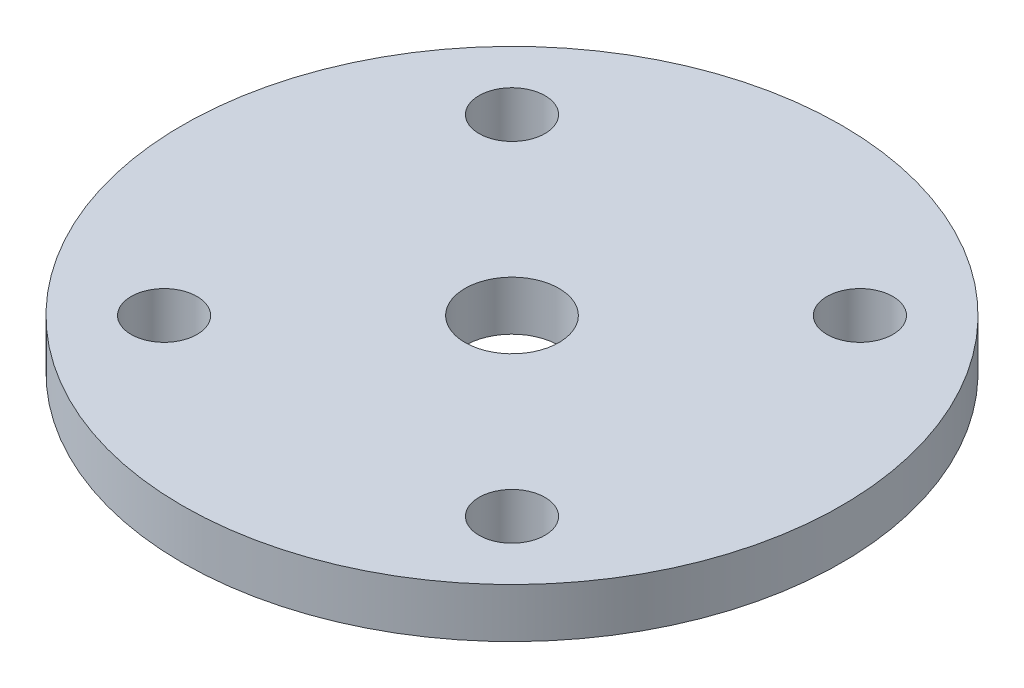
ISO-10303-21;
HEADER;
FILE_DESCRIPTION(('STEP AP214'),'2;1');
FILE_NAME('part.step','',(''),(''),'','','');
FILE_SCHEMA(('AUTOMOTIVE_DESIGN { 1 0 10303 214 1 1 1 1 }'));
ENDSEC;
DATA;
#1=APPLICATION_CONTEXT('core data for automotive mechanical design processes');
#2=APPLICATION_PROTOCOL_DEFINITION('international standard','automotive_design',2000,#1);
#3=PRODUCT_CONTEXT('',#1,'mechanical');
#4=PRODUCT('Part','Part','',(#3));
#5=PRODUCT_RELATED_PRODUCT_CATEGORY('part','',(#4));
#6=PRODUCT_DEFINITION_FORMATION('','',#4);
#7=PRODUCT_DEFINITION_CONTEXT('part definition',#1,'design');
#8=PRODUCT_DEFINITION('design','',#6,#7);
#9=PRODUCT_DEFINITION_SHAPE('','',#8);
#10=(LENGTH_UNIT() NAMED_UNIT(*) SI_UNIT(.MILLI.,.METRE.));
#11=(NAMED_UNIT(*) PLANE_ANGLE_UNIT() SI_UNIT($,.RADIAN.));
#12=(NAMED_UNIT(*) SI_UNIT($,.STERADIAN.) SOLID_ANGLE_UNIT());
#13=UNCERTAINTY_MEASURE_WITH_UNIT(LENGTH_MEASURE(1.E-05),#10,'distance_accuracy_value','');
#14=(GEOMETRIC_REPRESENTATION_CONTEXT(3) GLOBAL_UNCERTAINTY_ASSIGNED_CONTEXT((#13)) GLOBAL_UNIT_ASSIGNED_CONTEXT((#10,
#11,#12)) REPRESENTATION_CONTEXT('',''));
#15=CARTESIAN_POINT('',(0.,0.,0.));
#16=DIRECTION('',(0.,0.,1.));
#17=DIRECTION('',(1.,0.,0.));
#18=AXIS2_PLACEMENT_3D('',#15,#16,#17);
#19=CARTESIAN_POINT('',(0.,0.,0.));
#20=DIRECTION('',(0.,-1.,0.));
#21=DIRECTION('',(0.,0.,-1.));
#22=AXIS2_PLACEMENT_3D('',#19,#20,#21);
#23=CYLINDRICAL_SURFACE('',#22,20.);
#24=CARTESIAN_POINT('',(0.,0.,0.));
#25=DIRECTION('',(0.,-1.,0.));
#26=DIRECTION('',(0.,0.,1.));
#27=AXIS2_PLACEMENT_3D('',#24,#25,#26);
#28=CIRCLE('',#27,20.);
#29=CARTESIAN_POINT('',(0.,0.,20.));
#30=VERTEX_POINT('',#29);
#31=EDGE_CURVE('E10',#30,#30,#28,.T.);
#32=ORIENTED_EDGE('',*,*,#31,.T.);
#33=EDGE_LOOP('',(#32));
#34=FACE_BOUND('',#33,.T.);
#35=CARTESIAN_POINT('',(0.,-3.,0.));
#36=DIRECTION('',(0.,-1.,0.));
#37=DIRECTION('',(0.,0.,1.));
#38=AXIS2_PLACEMENT_3D('',#35,#36,#37);
#39=CIRCLE('',#38,20.);
#40=CARTESIAN_POINT('',(0.,-3.,20.));
#41=VERTEX_POINT('',#40);
#42=EDGE_CURVE('E38',#41,#41,#39,.T.);
#43=ORIENTED_EDGE('',*,*,#42,.F.);
#44=EDGE_LOOP('',(#43));
#45=FACE_BOUND('',#44,.T.);
#46=ADVANCED_FACE('F35',(#34,#45),#23,.T.);
#47=CARTESIAN_POINT('',(0.,0.,0.));
#48=DIRECTION('',(0.,1.,0.));
#49=DIRECTION('',(0.,0.,1.));
#50=AXIS2_PLACEMENT_3D('',#47,#48,#49);
#51=PLANE('',#50);
#52=CARTESIAN_POINT('',(-10.5571042431151,0.,10.5571042431152));
#53=DIRECTION('',(0.,-1.,0.));
#54=DIRECTION('',(0.,0.,1.));
#55=AXIS2_PLACEMENT_3D('',#52,#53,#54);
#56=CIRCLE('',#55,2.);
#57=CARTESIAN_POINT('',(-10.5571042431151,0.,12.5571042431152));
#58=VERTEX_POINT('',#57);
#59=EDGE_CURVE('E68',#58,#58,#56,.T.);
#60=ORIENTED_EDGE('',*,*,#59,.T.);
#61=EDGE_LOOP('',(#60));
#62=FACE_BOUND('',#61,.T.);
#63=CARTESIAN_POINT('',(-10.5571042431152,0.,-10.5571042431151));
#64=DIRECTION('',(0.,-1.,0.));
#65=DIRECTION('',(0.,0.,1.));
#66=AXIS2_PLACEMENT_3D('',#63,#64,#65);
#67=CIRCLE('',#66,2.);
#68=CARTESIAN_POINT('',(-10.5571042431152,0.,-8.55710424311514));
#69=VERTEX_POINT('',#68);
#70=EDGE_CURVE('E62',#69,#69,#67,.T.);
#71=ORIENTED_EDGE('',*,*,#70,.T.);
#72=EDGE_LOOP('',(#71));
#73=FACE_BOUND('',#72,.T.);
#74=CARTESIAN_POINT('',(10.5571042431151,0.,-10.5571042431152));
#75=DIRECTION('',(0.,-1.,0.));
#76=DIRECTION('',(0.,0.,1.));
#77=AXIS2_PLACEMENT_3D('',#74,#75,#76);
#78=CIRCLE('',#77,2.);
#79=CARTESIAN_POINT('',(10.5571042431151,0.,-8.55710424311516));
#80=VERTEX_POINT('',#79);
#81=EDGE_CURVE('E56',#80,#80,#78,.T.);
#82=ORIENTED_EDGE('',*,*,#81,.T.);
#83=EDGE_LOOP('',(#82));
#84=FACE_BOUND('',#83,.T.);
#85=CARTESIAN_POINT('',(10.5571042431152,0.,10.5571042431151));
#86=DIRECTION('',(0.,-1.,0.));
#87=DIRECTION('',(0.,0.,1.));
#88=AXIS2_PLACEMENT_3D('',#85,#86,#87);
#89=CIRCLE('',#88,2.);
#90=CARTESIAN_POINT('',(10.5571042431152,0.,12.5571042431151));
#91=VERTEX_POINT('',#90);
#92=EDGE_CURVE('E50',#91,#91,#89,.T.);
#93=ORIENTED_EDGE('',*,*,#92,.T.);
#94=EDGE_LOOP('',(#93));
#95=FACE_BOUND('',#94,.T.);
#96=CARTESIAN_POINT('',(0.,0.,0.));
#97=DIRECTION('',(0.,-1.,0.));
#98=DIRECTION('',(0.,0.,1.));
#99=AXIS2_PLACEMENT_3D('',#96,#97,#98);
#100=CIRCLE('',#99,2.85);
#101=CARTESIAN_POINT('',(0.,0.,2.85));
#102=VERTEX_POINT('',#101);
#103=EDGE_CURVE('E45',#102,#102,#100,.T.);
#104=ORIENTED_EDGE('',*,*,#103,.T.);
#105=EDGE_LOOP('',(#104));
#106=FACE_BOUND('',#105,.T.);
#107=ORIENTED_EDGE('',*,*,#31,.F.);
#108=EDGE_LOOP('',(#107));
#109=FACE_BOUND('',#108,.T.);
#110=ADVANCED_FACE('F77',(#62,#73,#84,#95,#106,#109),#51,.T.);
#111=CARTESIAN_POINT('',(0.,-3.,0.));
#112=DIRECTION('',(0.,1.,0.));
#113=DIRECTION('',(0.,0.,1.));
#114=AXIS2_PLACEMENT_3D('',#111,#112,#113);
#115=PLANE('',#114);
#116=CARTESIAN_POINT('',(-10.5571042431151,-3.,10.5571042431152));
#117=DIRECTION('',(0.,-1.,0.));
#118=DIRECTION('',(0.,0.,1.));
#119=AXIS2_PLACEMENT_3D('',#116,#117,#118);
#120=CIRCLE('',#119,2.);
#121=CARTESIAN_POINT('',(-10.5571042431151,-3.,12.5571042431152));
#122=VERTEX_POINT('',#121);
#123=EDGE_CURVE('E71',#122,#122,#120,.T.);
#124=ORIENTED_EDGE('',*,*,#123,.F.);
#125=EDGE_LOOP('',(#124));
#126=FACE_BOUND('',#125,.T.);
#127=CARTESIAN_POINT('',(-10.5571042431152,-3.,-10.5571042431151));
#128=DIRECTION('',(0.,-1.,0.));
#129=DIRECTION('',(0.,0.,1.));
#130=AXIS2_PLACEMENT_3D('',#127,#128,#129);
#131=CIRCLE('',#130,2.);
#132=CARTESIAN_POINT('',(-10.5571042431152,-3.,-8.55710424311514));
#133=VERTEX_POINT('',#132);
#134=EDGE_CURVE('E65',#133,#133,#131,.T.);
#135=ORIENTED_EDGE('',*,*,#134,.F.);
#136=EDGE_LOOP('',(#135));
#137=FACE_BOUND('',#136,.T.);
#138=CARTESIAN_POINT('',(10.5571042431151,-3.,-10.5571042431152));
#139=DIRECTION('',(0.,-1.,0.));
#140=DIRECTION('',(0.,0.,1.));
#141=AXIS2_PLACEMENT_3D('',#138,#139,#140);
#142=CIRCLE('',#141,2.);
#143=CARTESIAN_POINT('',(10.5571042431151,-3.,-8.55710424311516));
#144=VERTEX_POINT('',#143);
#145=EDGE_CURVE('E59',#144,#144,#142,.T.);
#146=ORIENTED_EDGE('',*,*,#145,.F.);
#147=EDGE_LOOP('',(#146));
#148=FACE_BOUND('',#147,.T.);
#149=CARTESIAN_POINT('',(10.5571042431152,-3.,10.5571042431151));
#150=DIRECTION('',(0.,-1.,0.));
#151=DIRECTION('',(0.,0.,1.));
#152=AXIS2_PLACEMENT_3D('',#149,#150,#151);
#153=CIRCLE('',#152,2.);
#154=CARTESIAN_POINT('',(10.5571042431152,-3.,12.5571042431151));
#155=VERTEX_POINT('',#154);
#156=EDGE_CURVE('E53',#155,#155,#153,.T.);
#157=ORIENTED_EDGE('',*,*,#156,.F.);
#158=EDGE_LOOP('',(#157));
#159=FACE_BOUND('',#158,.T.);
#160=CARTESIAN_POINT('',(0.,-3.,0.));
#161=DIRECTION('',(0.,-1.,0.));
#162=DIRECTION('',(0.,0.,1.));
#163=AXIS2_PLACEMENT_3D('',#160,#161,#162);
#164=CIRCLE('',#163,2.85);
#165=CARTESIAN_POINT('',(0.,-3.,2.85));
#166=VERTEX_POINT('',#165);
#167=EDGE_CURVE('E47',#166,#166,#164,.T.);
#168=ORIENTED_EDGE('',*,*,#167,.F.);
#169=EDGE_LOOP('',(#168));
#170=FACE_BOUND('',#169,.T.);
#171=ORIENTED_EDGE('',*,*,#42,.T.);
#172=EDGE_LOOP('',(#171));
#173=FACE_BOUND('',#172,.T.);
#174=ADVANCED_FACE('F87',(#126,#137,#148,#159,#170,#173),#115,.F.);
#175=CARTESIAN_POINT('',(0.,0.,0.));
#176=DIRECTION('',(0.,-1.,0.));
#177=DIRECTION('',(0.,0.,-1.));
#178=AXIS2_PLACEMENT_3D('',#175,#176,#177);
#179=CYLINDRICAL_SURFACE('',#178,2.85);
#180=ORIENTED_EDGE('',*,*,#103,.F.);
#181=EDGE_LOOP('',(#180));
#182=FACE_BOUND('',#181,.T.);
#183=ORIENTED_EDGE('',*,*,#167,.T.);
#184=EDGE_LOOP('',(#183));
#185=FACE_BOUND('',#184,.T.);
#186=ADVANCED_FACE('F90',(#182,#185),#179,.F.);
#187=CARTESIAN_POINT('',(10.5571042431152,0.,10.5571042431151));
#188=DIRECTION('',(0.,-1.,0.));
#189=DIRECTION('',(0.,0.,-1.));
#190=AXIS2_PLACEMENT_3D('',#187,#188,#189);
#191=CYLINDRICAL_SURFACE('',#190,2.);
#192=ORIENTED_EDGE('',*,*,#92,.F.);
#193=EDGE_LOOP('',(#192));
#194=FACE_BOUND('',#193,.T.);
#195=ORIENTED_EDGE('',*,*,#156,.T.);
#196=EDGE_LOOP('',(#195));
#197=FACE_BOUND('',#196,.T.);
#198=ADVANCED_FACE('F111',(#194,#197),#191,.F.);
#199=CARTESIAN_POINT('',(10.5571042431151,0.,-10.5571042431152));
#200=DIRECTION('',(0.,-1.,0.));
#201=DIRECTION('',(0.,0.,-1.));
#202=AXIS2_PLACEMENT_3D('',#199,#200,#201);
#203=CYLINDRICAL_SURFACE('',#202,2.);
#204=ORIENTED_EDGE('',*,*,#81,.F.);
#205=EDGE_LOOP('',(#204));
#206=FACE_BOUND('',#205,.T.);
#207=ORIENTED_EDGE('',*,*,#145,.T.);
#208=EDGE_LOOP('',(#207));
#209=FACE_BOUND('',#208,.T.);
#210=ADVANCED_FACE('F115',(#206,#209),#203,.F.);
#211=CARTESIAN_POINT('',(-10.5571042431152,0.,-10.5571042431151));
#212=DIRECTION('',(0.,-1.,0.));
#213=DIRECTION('',(0.,0.,-1.));
#214=AXIS2_PLACEMENT_3D('',#211,#212,#213);
#215=CYLINDRICAL_SURFACE('',#214,2.);
#216=ORIENTED_EDGE('',*,*,#70,.F.);
#217=EDGE_LOOP('',(#216));
#218=FACE_BOUND('',#217,.T.);
#219=ORIENTED_EDGE('',*,*,#134,.T.);
#220=EDGE_LOOP('',(#219));
#221=FACE_BOUND('',#220,.T.);
#222=ADVANCED_FACE('F83',(#218,#221),#215,.F.);
#223=CARTESIAN_POINT('',(-10.5571042431151,0.,10.5571042431152));
#224=DIRECTION('',(0.,-1.,0.));
#225=DIRECTION('',(0.,0.,-1.));
#226=AXIS2_PLACEMENT_3D('',#223,#224,#225);
#227=CYLINDRICAL_SURFACE('',#226,2.);
#228=ORIENTED_EDGE('',*,*,#59,.F.);
#229=EDGE_LOOP('',(#228));
#230=FACE_BOUND('',#229,.T.);
#231=ORIENTED_EDGE('',*,*,#123,.T.);
#232=EDGE_LOOP('',(#231));
#233=FACE_BOUND('',#232,.T.);
#234=ADVANCED_FACE('F80',(#230,#233),#227,.F.);
#235=CLOSED_SHELL('',(#46,#110,#174,#186,#198,#210,#222,#234));
#236=MANIFOLD_SOLID_BREP('B2',#235);
#237=ADVANCED_BREP_SHAPE_REPRESENTATION('',(#18,#236),#14);
#238=SHAPE_DEFINITION_REPRESENTATION(#9,#237);
ENDSEC;
END-ISO-10303-21;
